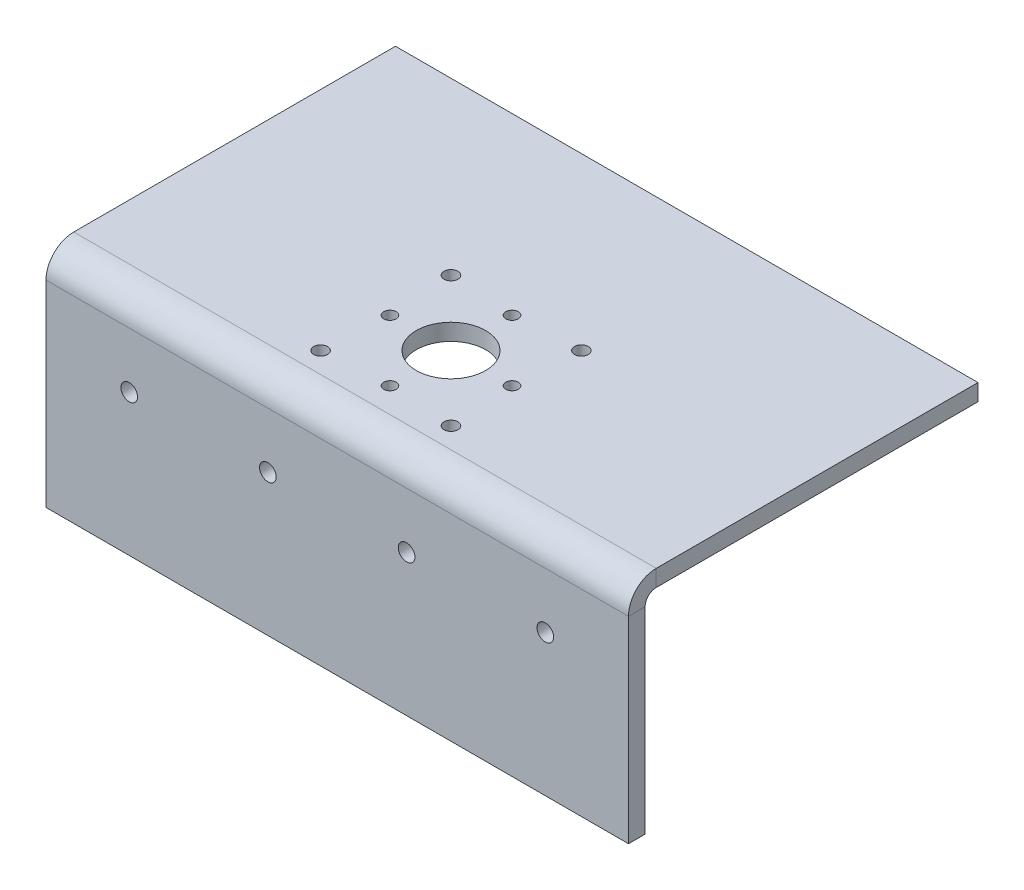
ISO-10303-21;
HEADER;
FILE_DESCRIPTION(('STEP AP214'),'2;1');
FILE_NAME('part.step','',(''),(''),'','','');
FILE_SCHEMA(('AUTOMOTIVE_DESIGN { 1 0 10303 214 1 1 1 1 }'));
ENDSEC;
DATA;
#1=APPLICATION_CONTEXT('core data for automotive mechanical design processes');
#2=APPLICATION_PROTOCOL_DEFINITION('international standard','automotive_design',2000,#1);
#3=PRODUCT_CONTEXT('',#1,'mechanical');
#4=PRODUCT('Part','Part','',(#3));
#5=PRODUCT_RELATED_PRODUCT_CATEGORY('part','',(#4));
#6=PRODUCT_DEFINITION_FORMATION('','',#4);
#7=PRODUCT_DEFINITION_CONTEXT('part definition',#1,'design');
#8=PRODUCT_DEFINITION('design','',#6,#7);
#9=PRODUCT_DEFINITION_SHAPE('','',#8);
#10=(LENGTH_UNIT() NAMED_UNIT(*) SI_UNIT(.MILLI.,.METRE.));
#11=(NAMED_UNIT(*) PLANE_ANGLE_UNIT() SI_UNIT($,.RADIAN.));
#12=(NAMED_UNIT(*) SI_UNIT($,.STERADIAN.) SOLID_ANGLE_UNIT());
#13=UNCERTAINTY_MEASURE_WITH_UNIT(LENGTH_MEASURE(1.E-05),#10,'distance_accuracy_value','');
#14=(GEOMETRIC_REPRESENTATION_CONTEXT(3) GLOBAL_UNCERTAINTY_ASSIGNED_CONTEXT((#13)) GLOBAL_UNIT_ASSIGNED_CONTEXT((#10,
#11,#12)) REPRESENTATION_CONTEXT('',''));
#15=CARTESIAN_POINT('',(0.,0.,0.));
#16=DIRECTION('',(0.,0.,1.));
#17=DIRECTION('',(1.,0.,0.));
#18=AXIS2_PLACEMENT_3D('',#15,#16,#17);
#19=CARTESIAN_POINT('',(105.,-4.,0.));
#20=DIRECTION('',(1.,0.,0.));
#21=DIRECTION('',(0.,0.,-1.));
#22=AXIS2_PLACEMENT_3D('',#19,#20,#21);
#23=PLANE('',#22);
#24=DIRECTION('',(0.,0.,1.));
#25=VECTOR('',#24,1.);
#26=CARTESIAN_POINT('',(105.,-4.,0.));
#27=LINE('',#26,#25);
#28=CARTESIAN_POINT('',(105.,-4.,0.));
#29=VERTEX_POINT('',#28);
#30=CARTESIAN_POINT('',(105.,-4.00000000000001,6.));
#31=VERTEX_POINT('',#30);
#32=EDGE_CURVE('E11',#29,#31,#27,.T.);
#33=ORIENTED_EDGE('',*,*,#32,.F.);
#34=CARTESIAN_POINT('',(105.,-4.,-4.));
#35=DIRECTION('',(1.,0.,0.));
#36=DIRECTION('',(0.,0.,-1.));
#37=AXIS2_PLACEMENT_3D('',#34,#35,#36);
#38=CIRCLE('',#37,4.);
#39=CARTESIAN_POINT('',(105.,0.,-4.));
#40=VERTEX_POINT('',#39);
#41=EDGE_CURVE('E129',#29,#40,#38,.F.);
#42=ORIENTED_EDGE('',*,*,#41,.T.);
#43=DIRECTION('',(0.,-1.,0.));
#44=VECTOR('',#43,1.);
#45=CARTESIAN_POINT('',(105.,6.,-4.));
#46=LINE('',#45,#44);
#47=CARTESIAN_POINT('',(105.,6.,-4.));
#48=VERTEX_POINT('',#47);
#49=EDGE_CURVE('E46',#48,#40,#46,.T.);
#50=ORIENTED_EDGE('',*,*,#49,.F.);
#51=CARTESIAN_POINT('',(105.,-4.,-4.));
#52=DIRECTION('',(1.,0.,0.));
#53=DIRECTION('',(0.,0.,-1.));
#54=AXIS2_PLACEMENT_3D('',#51,#52,#53);
#55=CIRCLE('',#54,10.);
#56=EDGE_CURVE('E136',#31,#48,#55,.F.);
#57=ORIENTED_EDGE('',*,*,#56,.F.);
#58=EDGE_LOOP('',(#33,#42,#50,#57));
#59=FACE_BOUND('',#58,.T.);
#60=ADVANCED_FACE('F37',(#59),#23,.T.);
#61=CARTESIAN_POINT('',(105.,6.,-4.));
#62=DIRECTION('',(1.,0.,0.));
#63=DIRECTION('',(0.,0.,-1.));
#64=AXIS2_PLACEMENT_3D('',#61,#62,#63);
#65=PLANE('',#64);
#66=DIRECTION('',(0.,1.,0.));
#67=VECTOR('',#66,1.);
#68=CARTESIAN_POINT('',(105.,-75.,0.));
#69=LINE('',#68,#67);
#70=CARTESIAN_POINT('',(105.,-75.,0.));
#71=VERTEX_POINT('',#70);
#72=EDGE_CURVE('E124',#71,#29,#69,.T.);
#73=ORIENTED_EDGE('',*,*,#72,.T.);
#74=ORIENTED_EDGE('',*,*,#32,.T.);
#75=DIRECTION('',(0.,1.,0.));
#76=VECTOR('',#75,1.);
#77=CARTESIAN_POINT('',(105.,-75.,6.));
#78=LINE('',#77,#76);
#79=CARTESIAN_POINT('',(105.,-75.,6.));
#80=VERTEX_POINT('',#79);
#81=EDGE_CURVE('E134',#80,#31,#78,.T.);
#82=ORIENTED_EDGE('',*,*,#81,.F.);
#83=DIRECTION('',(0.,0.,1.));
#84=VECTOR('',#83,1.);
#85=CARTESIAN_POINT('',(105.,-75.,0.));
#86=LINE('',#85,#84);
#87=EDGE_CURVE('E115',#71,#80,#86,.T.);
#88=ORIENTED_EDGE('',*,*,#87,.F.);
#89=EDGE_LOOP('',(#73,#74,#82,#88));
#90=FACE_BOUND('',#89,.T.);
#91=ADVANCED_FACE('F132',(#90),#65,.T.);
#92=CARTESIAN_POINT('',(-105.,0.,-4.));
#93=DIRECTION('',(-1.,0.,0.));
#94=DIRECTION('',(0.,0.,1.));
#95=AXIS2_PLACEMENT_3D('',#92,#93,#94);
#96=PLANE('',#95);
#97=DIRECTION('',(0.,1.,0.));
#98=VECTOR('',#97,1.);
#99=CARTESIAN_POINT('',(-105.,0.,-4.));
#100=LINE('',#99,#98);
#101=CARTESIAN_POINT('',(-105.,0.,-4.));
#102=VERTEX_POINT('',#101);
#103=CARTESIAN_POINT('',(-105.,6.,-4.));
#104=VERTEX_POINT('',#103);
#105=EDGE_CURVE('E90',#102,#104,#100,.T.);
#106=ORIENTED_EDGE('',*,*,#105,.F.);
#107=CARTESIAN_POINT('',(-105.,-4.,-4.));
#108=DIRECTION('',(1.,0.,0.));
#109=DIRECTION('',(0.,0.,-1.));
#110=AXIS2_PLACEMENT_3D('',#107,#108,#109);
#111=CIRCLE('',#110,4.);
#112=CARTESIAN_POINT('',(-105.,-4.,0.));
#113=VERTEX_POINT('',#112);
#114=EDGE_CURVE('E159',#113,#102,#111,.F.);
#115=ORIENTED_EDGE('',*,*,#114,.F.);
#116=DIRECTION('',(0.,0.,-1.));
#117=VECTOR('',#116,1.);
#118=CARTESIAN_POINT('',(-105.,-4.00000000000001,6.));
#119=LINE('',#118,#117);
#120=CARTESIAN_POINT('',(-105.,-4.00000000000001,6.));
#121=VERTEX_POINT('',#120);
#122=EDGE_CURVE('E83',#121,#113,#119,.T.);
#123=ORIENTED_EDGE('',*,*,#122,.F.);
#124=CARTESIAN_POINT('',(-105.,-4.,-4.));
#125=DIRECTION('',(1.,0.,0.));
#126=DIRECTION('',(0.,0.,-1.));
#127=AXIS2_PLACEMENT_3D('',#124,#125,#126);
#128=CIRCLE('',#127,10.);
#129=EDGE_CURVE('E152',#121,#104,#128,.F.);
#130=ORIENTED_EDGE('',*,*,#129,.T.);
#131=EDGE_LOOP('',(#106,#115,#123,#130));
#132=FACE_BOUND('',#131,.T.);
#133=ADVANCED_FACE('F242',(#132),#96,.T.);
#134=CARTESIAN_POINT('',(-105.,-4.00000000000001,6.));
#135=DIRECTION('',(-1.,0.,0.));
#136=DIRECTION('',(0.,0.,1.));
#137=AXIS2_PLACEMENT_3D('',#134,#135,#136);
#138=PLANE('',#137);
#139=DIRECTION('',(0.,0.,-1.));
#140=VECTOR('',#139,1.);
#141=CARTESIAN_POINT('',(-105.,0.,0.));
#142=LINE('',#141,#140);
#143=CARTESIAN_POINT('',(-105.,0.,-120.));
#144=VERTEX_POINT('',#143);
#145=EDGE_CURVE('E142',#102,#144,#142,.T.);
#146=ORIENTED_EDGE('',*,*,#145,.F.);
#147=ORIENTED_EDGE('',*,*,#105,.T.);
#148=DIRECTION('',(0.,0.,-1.));
#149=VECTOR('',#148,1.);
#150=CARTESIAN_POINT('',(-105.,6.,0.));
#151=LINE('',#150,#149);
#152=CARTESIAN_POINT('',(-105.,6.,-120.));
#153=VERTEX_POINT('',#152);
#154=EDGE_CURVE('E149',#104,#153,#151,.T.);
#155=ORIENTED_EDGE('',*,*,#154,.T.);
#156=DIRECTION('',(0.,-1.,0.));
#157=VECTOR('',#156,1.);
#158=CARTESIAN_POINT('',(-105.,6.,-120.));
#159=LINE('',#158,#157);
#160=EDGE_CURVE('E145',#153,#144,#159,.T.);
#161=ORIENTED_EDGE('',*,*,#160,.T.);
#162=EDGE_LOOP('',(#146,#147,#155,#161));
#163=FACE_BOUND('',#162,.T.);
#164=ADVANCED_FACE('F244',(#163),#138,.T.);
#165=CARTESIAN_POINT('',(105.,0.,0.));
#166=DIRECTION('',(0.,1.,0.));
#167=DIRECTION('',(0.,0.,1.));
#168=AXIS2_PLACEMENT_3D('',#165,#166,#167);
#169=PLANE('',#168);
#170=CARTESIAN_POINT('',(0.,0.,-13.));
#171=DIRECTION('',(0.,1.,0.));
#172=DIRECTION('',(0.,0.,1.));
#173=AXIS2_PLACEMENT_3D('',#170,#171,#172);
#174=CIRCLE('',#173,2.25);
#175=CARTESIAN_POINT('',(0.,0.,-10.75));
#176=VERTEX_POINT('',#175);
#177=EDGE_CURVE('E509',#176,#176,#174,.T.);
#178=ORIENTED_EDGE('',*,*,#177,.T.);
#179=EDGE_LOOP('',(#178));
#180=FACE_BOUND('',#179,.T.);
#181=CARTESIAN_POINT('',(-22.,0.,-35.));
#182=DIRECTION('',(0.,1.,0.));
#183=DIRECTION('',(0.,0.,1.));
#184=AXIS2_PLACEMENT_3D('',#181,#182,#183);
#185=CIRCLE('',#184,2.24999999999992);
#186=CARTESIAN_POINT('',(-22.,0.,-32.7500000000001));
#187=VERTEX_POINT('',#186);
#188=EDGE_CURVE('E511',#187,#187,#185,.T.);
#189=ORIENTED_EDGE('',*,*,#188,.T.);
#190=EDGE_LOOP('',(#189));
#191=FACE_BOUND('',#190,.T.);
#192=CARTESIAN_POINT('',(1.58768695465517E-13,0.,-57.));
#193=DIRECTION('',(0.,1.,0.));
#194=DIRECTION('',(0.,0.,1.));
#195=AXIS2_PLACEMENT_3D('',#192,#193,#194);
#196=CIRCLE('',#195,2.25);
#197=CARTESIAN_POINT('',(1.58768695465517E-13,0.,-54.75));
#198=VERTEX_POINT('',#197);
#199=EDGE_CURVE('E517',#198,#198,#196,.T.);
#200=ORIENTED_EDGE('',*,*,#199,.T.);
#201=EDGE_LOOP('',(#200));
#202=FACE_BOUND('',#201,.T.);
#203=CARTESIAN_POINT('',(22.,0.,-35.));
#204=DIRECTION('',(0.,1.,0.));
#205=DIRECTION('',(0.,0.,1.));
#206=AXIS2_PLACEMENT_3D('',#203,#204,#205);
#207=CIRCLE('',#206,2.24999999999976);
#208=CARTESIAN_POINT('',(22.,0.,-32.7500000000002));
#209=VERTEX_POINT('',#208);
#210=EDGE_CURVE('E566',#209,#209,#207,.T.);
#211=ORIENTED_EDGE('',*,*,#210,.T.);
#212=EDGE_LOOP('',(#211));
#213=FACE_BOUND('',#212,.T.);
#214=CARTESIAN_POINT('',(23.5,0.,-11.5));
#215=DIRECTION('',(0.,1.,0.));
#216=DIRECTION('',(0.,0.,1.));
#217=AXIS2_PLACEMENT_3D('',#214,#215,#216);
#218=CIRCLE('',#217,2.5);
#219=CARTESIAN_POINT('',(23.5,0.,-9.));
#220=VERTEX_POINT('',#219);
#221=EDGE_CURVE('E146',#220,#220,#218,.T.);
#222=ORIENTED_EDGE('',*,*,#221,.T.);
#223=EDGE_LOOP('',(#222));
#224=FACE_BOUND('',#223,.T.);
#225=CARTESIAN_POINT('',(-23.5,0.,-11.5));
#226=DIRECTION('',(0.,1.,0.));
#227=DIRECTION('',(0.,0.,1.));
#228=AXIS2_PLACEMENT_3D('',#225,#226,#227);
#229=CIRCLE('',#228,2.5);
#230=CARTESIAN_POINT('',(-23.5,0.,-9.));
#231=VERTEX_POINT('',#230);
#232=EDGE_CURVE('E215',#231,#231,#229,.T.);
#233=ORIENTED_EDGE('',*,*,#232,.T.);
#234=EDGE_LOOP('',(#233));
#235=FACE_BOUND('',#234,.T.);
#236=CARTESIAN_POINT('',(-23.5,0.,-58.5));
#237=DIRECTION('',(0.,1.,0.));
#238=DIRECTION('',(0.,0.,1.));
#239=AXIS2_PLACEMENT_3D('',#236,#237,#238);
#240=CIRCLE('',#239,2.5);
#241=CARTESIAN_POINT('',(-23.5,0.,-56.));
#242=VERTEX_POINT('',#241);
#243=EDGE_CURVE('E212',#242,#242,#240,.T.);
#244=ORIENTED_EDGE('',*,*,#243,.T.);
#245=EDGE_LOOP('',(#244));
#246=FACE_BOUND('',#245,.T.);
#247=CARTESIAN_POINT('',(23.5,0.,-58.5));
#248=DIRECTION('',(0.,1.,0.));
#249=DIRECTION('',(0.,0.,1.));
#250=AXIS2_PLACEMENT_3D('',#247,#248,#249);
#251=CIRCLE('',#250,2.5);
#252=CARTESIAN_POINT('',(23.5,0.,-56.));
#253=VERTEX_POINT('',#252);
#254=EDGE_CURVE('E209',#253,#253,#251,.T.);
#255=ORIENTED_EDGE('',*,*,#254,.T.);
#256=EDGE_LOOP('',(#255));
#257=FACE_BOUND('',#256,.T.);
#258=CARTESIAN_POINT('',(0.,0.,-35.));
#259=DIRECTION('',(0.,1.,0.));
#260=DIRECTION('',(0.,0.,1.));
#261=AXIS2_PLACEMENT_3D('',#258,#259,#260);
#262=CIRCLE('',#261,12.5);
#263=CARTESIAN_POINT('',(0.,0.,-22.5));
#264=VERTEX_POINT('',#263);
#265=EDGE_CURVE('E205',#264,#264,#262,.T.);
#266=ORIENTED_EDGE('',*,*,#265,.T.);
#267=EDGE_LOOP('',(#266));
#268=FACE_BOUND('',#267,.T.);
#269=ORIENTED_EDGE('',*,*,#145,.T.);
#270=DIRECTION('',(-1.,0.,0.));
#271=VECTOR('',#270,1.);
#272=CARTESIAN_POINT('',(105.,0.,-120.));
#273=LINE('',#272,#271);
#274=CARTESIAN_POINT('',(105.,0.,-120.));
#275=VERTEX_POINT('',#274);
#276=EDGE_CURVE('E173',#275,#144,#273,.T.);
#277=ORIENTED_EDGE('',*,*,#276,.F.);
#278=DIRECTION('',(0.,0.,-1.));
#279=VECTOR('',#278,1.);
#280=CARTESIAN_POINT('',(105.,0.,0.));
#281=LINE('',#280,#279);
#282=EDGE_CURVE('E96',#40,#275,#281,.T.);
#283=ORIENTED_EDGE('',*,*,#282,.F.);
#284=DIRECTION('',(-1.,0.,0.));
#285=VECTOR('',#284,1.);
#286=CARTESIAN_POINT('',(105.,0.,-4.));
#287=LINE('',#286,#285);
#288=EDGE_CURVE('E141',#40,#102,#287,.T.);
#289=ORIENTED_EDGE('',*,*,#288,.T.);
#290=EDGE_LOOP('',(#269,#277,#283,#289));
#291=FACE_BOUND('',#290,.T.);
#292=ADVANCED_FACE('F250',(#180,#191,#202,#213,#224,#235,#246,#257,#268,#291),#169,.F.);
#293=CARTESIAN_POINT('',(105.,6.,-120.));
#294=DIRECTION('',(0.,0.,-1.));
#295=DIRECTION('',(-1.,0.,0.));
#296=AXIS2_PLACEMENT_3D('',#293,#294,#295);
#297=PLANE('',#296);
#298=ORIENTED_EDGE('',*,*,#160,.F.);
#299=DIRECTION('',(-1.,0.,0.));
#300=VECTOR('',#299,1.);
#301=CARTESIAN_POINT('',(105.,6.,-120.));
#302=LINE('',#301,#300);
#303=CARTESIAN_POINT('',(105.,6.,-120.));
#304=VERTEX_POINT('',#303);
#305=EDGE_CURVE('E171',#304,#153,#302,.T.);
#306=ORIENTED_EDGE('',*,*,#305,.F.);
#307=DIRECTION('',(0.,-1.,0.));
#308=VECTOR('',#307,1.);
#309=CARTESIAN_POINT('',(105.,6.,-120.));
#310=LINE('',#309,#308);
#311=EDGE_CURVE('E221',#304,#275,#310,.T.);
#312=ORIENTED_EDGE('',*,*,#311,.T.);
#313=ORIENTED_EDGE('',*,*,#276,.T.);
#314=EDGE_LOOP('',(#298,#306,#312,#313));
#315=FACE_BOUND('',#314,.T.);
#316=ADVANCED_FACE('F280',(#315),#297,.T.);
#317=CARTESIAN_POINT('',(105.,6.,0.));
#318=DIRECTION('',(0.,1.,0.));
#319=DIRECTION('',(0.,0.,1.));
#320=AXIS2_PLACEMENT_3D('',#317,#318,#319);
#321=PLANE('',#320);
#322=CARTESIAN_POINT('',(0.,6.,-13.));
#323=DIRECTION('',(0.,1.,0.));
#324=DIRECTION('',(0.,0.,1.));
#325=AXIS2_PLACEMENT_3D('',#322,#323,#324);
#326=CIRCLE('',#325,2.25);
#327=CARTESIAN_POINT('',(0.,6.,-10.75));
#328=VERTEX_POINT('',#327);
#329=EDGE_CURVE('E506',#328,#328,#326,.T.);
#330=ORIENTED_EDGE('',*,*,#329,.F.);
#331=EDGE_LOOP('',(#330));
#332=FACE_BOUND('',#331,.T.);
#333=CARTESIAN_POINT('',(-22.,6.,-35.));
#334=DIRECTION('',(0.,1.,0.));
#335=DIRECTION('',(0.,0.,1.));
#336=AXIS2_PLACEMENT_3D('',#333,#334,#335);
#337=CIRCLE('',#336,2.24999999999992);
#338=CARTESIAN_POINT('',(-22.,6.,-32.7500000000001));
#339=VERTEX_POINT('',#338);
#340=EDGE_CURVE('E575',#339,#339,#337,.T.);
#341=ORIENTED_EDGE('',*,*,#340,.F.);
#342=EDGE_LOOP('',(#341));
#343=FACE_BOUND('',#342,.T.);
#344=CARTESIAN_POINT('',(1.58768695465517E-13,6.,-57.));
#345=DIRECTION('',(0.,1.,0.));
#346=DIRECTION('',(0.,0.,1.));
#347=AXIS2_PLACEMENT_3D('',#344,#345,#346);
#348=CIRCLE('',#347,2.25);
#349=CARTESIAN_POINT('',(1.58768695465517E-13,6.,-54.75));
#350=VERTEX_POINT('',#349);
#351=EDGE_CURVE('E572',#350,#350,#348,.T.);
#352=ORIENTED_EDGE('',*,*,#351,.F.);
#353=EDGE_LOOP('',(#352));
#354=FACE_BOUND('',#353,.T.);
#355=CARTESIAN_POINT('',(22.,6.,-35.));
#356=DIRECTION('',(0.,1.,0.));
#357=DIRECTION('',(0.,0.,1.));
#358=AXIS2_PLACEMENT_3D('',#355,#356,#357);
#359=CIRCLE('',#358,2.24999999999976);
#360=CARTESIAN_POINT('',(22.,6.,-32.7500000000002));
#361=VERTEX_POINT('',#360);
#362=EDGE_CURVE('E569',#361,#361,#359,.T.);
#363=ORIENTED_EDGE('',*,*,#362,.F.);
#364=EDGE_LOOP('',(#363));
#365=FACE_BOUND('',#364,.T.);
#366=CARTESIAN_POINT('',(23.5,6.,-11.5));
#367=DIRECTION('',(0.,1.,0.));
#368=DIRECTION('',(0.,0.,1.));
#369=AXIS2_PLACEMENT_3D('',#366,#367,#368);
#370=CIRCLE('',#369,2.5);
#371=CARTESIAN_POINT('',(23.5,6.,-9.));
#372=VERTEX_POINT('',#371);
#373=EDGE_CURVE('E189',#372,#372,#370,.T.);
#374=ORIENTED_EDGE('',*,*,#373,.F.);
#375=EDGE_LOOP('',(#374));
#376=FACE_BOUND('',#375,.T.);
#377=CARTESIAN_POINT('',(-23.5,6.,-11.5));
#378=DIRECTION('',(0.,1.,0.));
#379=DIRECTION('',(0.,0.,1.));
#380=AXIS2_PLACEMENT_3D('',#377,#378,#379);
#381=CIRCLE('',#380,2.5);
#382=CARTESIAN_POINT('',(-23.5,6.,-9.));
#383=VERTEX_POINT('',#382);
#384=EDGE_CURVE('E193',#383,#383,#381,.T.);
#385=ORIENTED_EDGE('',*,*,#384,.F.);
#386=EDGE_LOOP('',(#385));
#387=FACE_BOUND('',#386,.T.);
#388=CARTESIAN_POINT('',(-23.5,6.,-58.5));
#389=DIRECTION('',(0.,1.,0.));
#390=DIRECTION('',(0.,0.,1.));
#391=AXIS2_PLACEMENT_3D('',#388,#389,#390);
#392=CIRCLE('',#391,2.5);
#393=CARTESIAN_POINT('',(-23.5,6.,-56.));
#394=VERTEX_POINT('',#393);
#395=EDGE_CURVE('E198',#394,#394,#392,.T.);
#396=ORIENTED_EDGE('',*,*,#395,.F.);
#397=EDGE_LOOP('',(#396));
#398=FACE_BOUND('',#397,.T.);
#399=CARTESIAN_POINT('',(23.5,6.,-58.5));
#400=DIRECTION('',(0.,1.,0.));
#401=DIRECTION('',(0.,0.,1.));
#402=AXIS2_PLACEMENT_3D('',#399,#400,#401);
#403=CIRCLE('',#402,2.5);
#404=CARTESIAN_POINT('',(23.5,6.,-56.));
#405=VERTEX_POINT('',#404);
#406=EDGE_CURVE('E206',#405,#405,#403,.T.);
#407=ORIENTED_EDGE('',*,*,#406,.F.);
#408=EDGE_LOOP('',(#407));
#409=FACE_BOUND('',#408,.T.);
#410=CARTESIAN_POINT('',(0.,6.,-35.));
#411=DIRECTION('',(0.,1.,0.));
#412=DIRECTION('',(0.,0.,1.));
#413=AXIS2_PLACEMENT_3D('',#410,#411,#412);
#414=CIRCLE('',#413,12.5);
#415=CARTESIAN_POINT('',(0.,6.,-22.5));
#416=VERTEX_POINT('',#415);
#417=EDGE_CURVE('E202',#416,#416,#414,.T.);
#418=ORIENTED_EDGE('',*,*,#417,.F.);
#419=EDGE_LOOP('',(#418));
#420=FACE_BOUND('',#419,.T.);
#421=ORIENTED_EDGE('',*,*,#154,.F.);
#422=DIRECTION('',(-1.,0.,0.));
#423=VECTOR('',#422,1.);
#424=CARTESIAN_POINT('',(105.,6.,-4.));
#425=LINE('',#424,#423);
#426=EDGE_CURVE('E168',#48,#104,#425,.T.);
#427=ORIENTED_EDGE('',*,*,#426,.F.);
#428=DIRECTION('',(0.,0.,-1.));
#429=VECTOR('',#428,1.);
#430=CARTESIAN_POINT('',(105.,6.,0.));
#431=LINE('',#430,#429);
#432=EDGE_CURVE('E224',#48,#304,#431,.T.);
#433=ORIENTED_EDGE('',*,*,#432,.T.);
#434=ORIENTED_EDGE('',*,*,#305,.T.);
#435=EDGE_LOOP('',(#421,#427,#433,#434));
#436=FACE_BOUND('',#435,.T.);
#437=ADVANCED_FACE('F285',(#332,#343,#354,#365,#376,#387,#398,#409,#420,#436),#321,.T.);
#438=CARTESIAN_POINT('',(105.,-4.,-4.));
#439=DIRECTION('',(-1.,0.,0.));
#440=DIRECTION('',(0.,0.,1.));
#441=AXIS2_PLACEMENT_3D('',#438,#439,#440);
#442=CYLINDRICAL_SURFACE('',#441,10.);
#443=ORIENTED_EDGE('',*,*,#129,.F.);
#444=DIRECTION('',(-1.,0.,0.));
#445=VECTOR('',#444,1.);
#446=CARTESIAN_POINT('',(105.,-4.00000000000001,6.));
#447=LINE('',#446,#445);
#448=EDGE_CURVE('E165',#31,#121,#447,.T.);
#449=ORIENTED_EDGE('',*,*,#448,.F.);
#450=ORIENTED_EDGE('',*,*,#56,.T.);
#451=ORIENTED_EDGE('',*,*,#426,.T.);
#452=EDGE_LOOP('',(#443,#449,#450,#451));
#453=FACE_BOUND('',#452,.T.);
#454=ADVANCED_FACE('F231',(#453),#442,.T.);
#455=CARTESIAN_POINT('',(105.,-75.,6.));
#456=DIRECTION('',(0.,0.,1.));
#457=DIRECTION('',(1.,0.,0.));
#458=AXIS2_PLACEMENT_3D('',#455,#456,#457);
#459=PLANE('',#458);
#460=CARTESIAN_POINT('',(-75.,-24.,6.));
#461=DIRECTION('',(0.,0.,1.));
#462=DIRECTION('',(1.,0.,0.));
#463=AXIS2_PLACEMENT_3D('',#460,#461,#462);
#464=CIRCLE('',#463,3.00000000000001);
#465=CARTESIAN_POINT('',(-72.,-24.,6.));
#466=VERTEX_POINT('',#465);
#467=EDGE_CURVE('E182',#466,#466,#464,.T.);
#468=ORIENTED_EDGE('',*,*,#467,.F.);
#469=EDGE_LOOP('',(#468));
#470=FACE_BOUND('',#469,.T.);
#471=CARTESIAN_POINT('',(-25.,-24.,6.));
#472=DIRECTION('',(0.,0.,1.));
#473=DIRECTION('',(1.,0.,0.));
#474=AXIS2_PLACEMENT_3D('',#471,#472,#473);
#475=CIRCLE('',#474,3.);
#476=CARTESIAN_POINT('',(-22.,-24.,6.));
#477=VERTEX_POINT('',#476);
#478=EDGE_CURVE('E523',#477,#477,#475,.T.);
#479=ORIENTED_EDGE('',*,*,#478,.F.);
#480=EDGE_LOOP('',(#479));
#481=FACE_BOUND('',#480,.T.);
#482=CARTESIAN_POINT('',(25.,-24.,6.));
#483=DIRECTION('',(0.,0.,1.));
#484=DIRECTION('',(1.,0.,0.));
#485=AXIS2_PLACEMENT_3D('',#482,#483,#484);
#486=CIRCLE('',#485,3.);
#487=CARTESIAN_POINT('',(28.,-24.,6.));
#488=VERTEX_POINT('',#487);
#489=EDGE_CURVE('E514',#488,#488,#486,.T.);
#490=ORIENTED_EDGE('',*,*,#489,.F.);
#491=EDGE_LOOP('',(#490));
#492=FACE_BOUND('',#491,.T.);
#493=CARTESIAN_POINT('',(75.,-24.,6.));
#494=DIRECTION('',(0.,0.,1.));
#495=DIRECTION('',(1.,0.,0.));
#496=AXIS2_PLACEMENT_3D('',#493,#494,#495);
#497=CIRCLE('',#496,3.00000000000001);
#498=CARTESIAN_POINT('',(78.,-24.,6.));
#499=VERTEX_POINT('',#498);
#500=EDGE_CURVE('E510',#499,#499,#497,.T.);
#501=ORIENTED_EDGE('',*,*,#500,.F.);
#502=EDGE_LOOP('',(#501));
#503=FACE_BOUND('',#502,.T.);
#504=DIRECTION('',(0.,1.,0.));
#505=VECTOR('',#504,1.);
#506=CARTESIAN_POINT('',(-105.,-75.,6.));
#507=LINE('',#506,#505);
#508=CARTESIAN_POINT('',(-105.,-75.,6.));
#509=VERTEX_POINT('',#508);
#510=EDGE_CURVE('E154',#509,#121,#507,.T.);
#511=ORIENTED_EDGE('',*,*,#510,.F.);
#512=DIRECTION('',(-1.,0.,0.));
#513=VECTOR('',#512,1.);
#514=CARTESIAN_POINT('',(105.,-75.,6.));
#515=LINE('',#514,#513);
#516=EDGE_CURVE('E119',#80,#509,#515,.T.);
#517=ORIENTED_EDGE('',*,*,#516,.F.);
#518=ORIENTED_EDGE('',*,*,#81,.T.);
#519=ORIENTED_EDGE('',*,*,#448,.T.);
#520=EDGE_LOOP('',(#511,#517,#518,#519));
#521=FACE_BOUND('',#520,.T.);
#522=ADVANCED_FACE('F237',(#470,#481,#492,#503,#521),#459,.T.);
#523=CARTESIAN_POINT('',(105.,-75.,0.));
#524=DIRECTION('',(0.,-1.,0.));
#525=DIRECTION('',(0.,0.,-1.));
#526=AXIS2_PLACEMENT_3D('',#523,#524,#525);
#527=PLANE('',#526);
#528=DIRECTION('',(0.,0.,1.));
#529=VECTOR('',#528,1.);
#530=CARTESIAN_POINT('',(-105.,-75.,0.));
#531=LINE('',#530,#529);
#532=CARTESIAN_POINT('',(-105.,-75.,0.));
#533=VERTEX_POINT('',#532);
#534=EDGE_CURVE('E117',#533,#509,#531,.T.);
#535=ORIENTED_EDGE('',*,*,#534,.F.);
#536=DIRECTION('',(-1.,0.,0.));
#537=VECTOR('',#536,1.);
#538=CARTESIAN_POINT('',(105.,-75.,0.));
#539=LINE('',#538,#537);
#540=EDGE_CURVE('E111',#71,#533,#539,.T.);
#541=ORIENTED_EDGE('',*,*,#540,.F.);
#542=ORIENTED_EDGE('',*,*,#87,.T.);
#543=ORIENTED_EDGE('',*,*,#516,.T.);
#544=EDGE_LOOP('',(#535,#541,#542,#543));
#545=FACE_BOUND('',#544,.T.);
#546=ADVANCED_FACE('F113',(#545),#527,.T.);
#547=CARTESIAN_POINT('',(105.,-75.,0.));
#548=DIRECTION('',(0.,0.,1.));
#549=DIRECTION('',(1.,0.,0.));
#550=AXIS2_PLACEMENT_3D('',#547,#548,#549);
#551=PLANE('',#550);
#552=CARTESIAN_POINT('',(-75.,-24.,0.));
#553=DIRECTION('',(0.,0.,1.));
#554=DIRECTION('',(1.,0.,0.));
#555=AXIS2_PLACEMENT_3D('',#552,#553,#554);
#556=CIRCLE('',#555,3.00000000000001);
#557=CARTESIAN_POINT('',(-72.,-24.,0.));
#558=VERTEX_POINT('',#557);
#559=EDGE_CURVE('E40',#558,#558,#556,.T.);
#560=ORIENTED_EDGE('',*,*,#559,.T.);
#561=EDGE_LOOP('',(#560));
#562=FACE_BOUND('',#561,.T.);
#563=CARTESIAN_POINT('',(-25.,-24.,0.));
#564=DIRECTION('',(0.,0.,1.));
#565=DIRECTION('',(1.,0.,0.));
#566=AXIS2_PLACEMENT_3D('',#563,#564,#565);
#567=CIRCLE('',#566,3.);
#568=CARTESIAN_POINT('',(-22.,-24.,0.));
#569=VERTEX_POINT('',#568);
#570=EDGE_CURVE('E184',#569,#569,#567,.T.);
#571=ORIENTED_EDGE('',*,*,#570,.T.);
#572=EDGE_LOOP('',(#571));
#573=FACE_BOUND('',#572,.T.);
#574=CARTESIAN_POINT('',(25.,-24.,0.));
#575=DIRECTION('',(0.,0.,1.));
#576=DIRECTION('',(1.,0.,0.));
#577=AXIS2_PLACEMENT_3D('',#574,#575,#576);
#578=CIRCLE('',#577,3.);
#579=CARTESIAN_POINT('',(28.,-24.,0.));
#580=VERTEX_POINT('',#579);
#581=EDGE_CURVE('E181',#580,#580,#578,.T.);
#582=ORIENTED_EDGE('',*,*,#581,.T.);
#583=EDGE_LOOP('',(#582));
#584=FACE_BOUND('',#583,.T.);
#585=CARTESIAN_POINT('',(75.,-24.,0.));
#586=DIRECTION('',(0.,0.,1.));
#587=DIRECTION('',(1.,0.,0.));
#588=AXIS2_PLACEMENT_3D('',#585,#586,#587);
#589=CIRCLE('',#588,3.00000000000001);
#590=CARTESIAN_POINT('',(78.,-24.,0.));
#591=VERTEX_POINT('',#590);
#592=EDGE_CURVE('E178',#591,#591,#589,.T.);
#593=ORIENTED_EDGE('',*,*,#592,.T.);
#594=EDGE_LOOP('',(#593));
#595=FACE_BOUND('',#594,.T.);
#596=DIRECTION('',(0.,1.,0.));
#597=VECTOR('',#596,1.);
#598=CARTESIAN_POINT('',(-105.,-75.,0.));
#599=LINE('',#598,#597);
#600=EDGE_CURVE('E157',#533,#113,#599,.T.);
#601=ORIENTED_EDGE('',*,*,#600,.T.);
#602=DIRECTION('',(-1.,0.,0.));
#603=VECTOR('',#602,1.);
#604=CARTESIAN_POINT('',(105.,-4.,0.));
#605=LINE('',#604,#603);
#606=EDGE_CURVE('E120',#29,#113,#605,.T.);
#607=ORIENTED_EDGE('',*,*,#606,.F.);
#608=ORIENTED_EDGE('',*,*,#72,.F.);
#609=ORIENTED_EDGE('',*,*,#540,.T.);
#610=EDGE_LOOP('',(#601,#607,#608,#609));
#611=FACE_BOUND('',#610,.T.);
#612=ADVANCED_FACE('F125',(#562,#573,#584,#595,#611),#551,.F.);
#613=CARTESIAN_POINT('',(105.,-4.,-4.));
#614=DIRECTION('',(-1.,0.,0.));
#615=DIRECTION('',(0.,0.,1.));
#616=AXIS2_PLACEMENT_3D('',#613,#614,#615);
#617=CYLINDRICAL_SURFACE('',#616,4.);
#618=ORIENTED_EDGE('',*,*,#114,.T.);
#619=ORIENTED_EDGE('',*,*,#288,.F.);
#620=ORIENTED_EDGE('',*,*,#41,.F.);
#621=ORIENTED_EDGE('',*,*,#606,.T.);
#622=EDGE_LOOP('',(#618,#619,#620,#621));
#623=FACE_BOUND('',#622,.T.);
#624=ADVANCED_FACE('F240',(#623),#617,.F.);
#625=CARTESIAN_POINT('',(105.,-4.,-4.));
#626=DIRECTION('',(1.,0.,0.));
#627=DIRECTION('',(0.,0.,-1.));
#628=AXIS2_PLACEMENT_3D('',#625,#626,#627);
#629=PLANE('',#628);
#630=ORIENTED_EDGE('',*,*,#282,.T.);
#631=ORIENTED_EDGE('',*,*,#311,.F.);
#632=ORIENTED_EDGE('',*,*,#432,.F.);
#633=ORIENTED_EDGE('',*,*,#49,.T.);
#634=EDGE_LOOP('',(#630,#631,#632,#633));
#635=FACE_BOUND('',#634,.T.);
#636=ADVANCED_FACE('F320',(#635),#629,.T.);
#637=CARTESIAN_POINT('',(-105.,-4.,-4.));
#638=DIRECTION('',(1.,0.,0.));
#639=DIRECTION('',(0.,0.,-1.));
#640=AXIS2_PLACEMENT_3D('',#637,#638,#639);
#641=PLANE('',#640);
#642=ORIENTED_EDGE('',*,*,#510,.T.);
#643=ORIENTED_EDGE('',*,*,#122,.T.);
#644=ORIENTED_EDGE('',*,*,#600,.F.);
#645=ORIENTED_EDGE('',*,*,#534,.T.);
#646=EDGE_LOOP('',(#642,#643,#644,#645));
#647=FACE_BOUND('',#646,.T.);
#648=ADVANCED_FACE('F238',(#647),#641,.F.);
#649=CARTESIAN_POINT('',(0.,-4.,-35.));
#650=DIRECTION('',(0.,1.,0.));
#651=DIRECTION('',(0.,0.,1.));
#652=AXIS2_PLACEMENT_3D('',#649,#650,#651);
#653=CYLINDRICAL_SURFACE('',#652,12.5);
#654=ORIENTED_EDGE('',*,*,#417,.T.);
#655=EDGE_LOOP('',(#654));
#656=FACE_BOUND('',#655,.T.);
#657=ORIENTED_EDGE('',*,*,#265,.F.);
#658=EDGE_LOOP('',(#657));
#659=FACE_BOUND('',#658,.T.);
#660=ADVANCED_FACE('F339',(#656,#659),#653,.F.);
#661=CARTESIAN_POINT('',(23.5,-4.,-58.5));
#662=DIRECTION('',(0.,1.,0.));
#663=DIRECTION('',(0.,0.,1.));
#664=AXIS2_PLACEMENT_3D('',#661,#662,#663);
#665=CYLINDRICAL_SURFACE('',#664,2.5);
#666=ORIENTED_EDGE('',*,*,#406,.T.);
#667=EDGE_LOOP('',(#666));
#668=FACE_BOUND('',#667,.T.);
#669=ORIENTED_EDGE('',*,*,#254,.F.);
#670=EDGE_LOOP('',(#669));
#671=FACE_BOUND('',#670,.T.);
#672=ADVANCED_FACE('F349',(#668,#671),#665,.F.);
#673=CARTESIAN_POINT('',(-23.5,-4.,-58.5));
#674=DIRECTION('',(0.,1.,0.));
#675=DIRECTION('',(0.,0.,1.));
#676=AXIS2_PLACEMENT_3D('',#673,#674,#675);
#677=CYLINDRICAL_SURFACE('',#676,2.5);
#678=ORIENTED_EDGE('',*,*,#395,.T.);
#679=EDGE_LOOP('',(#678));
#680=FACE_BOUND('',#679,.T.);
#681=ORIENTED_EDGE('',*,*,#243,.F.);
#682=EDGE_LOOP('',(#681));
#683=FACE_BOUND('',#682,.T.);
#684=ADVANCED_FACE('F359',(#680,#683),#677,.F.);
#685=CARTESIAN_POINT('',(-23.5,-4.,-11.5));
#686=DIRECTION('',(0.,1.,0.));
#687=DIRECTION('',(0.,0.,1.));
#688=AXIS2_PLACEMENT_3D('',#685,#686,#687);
#689=CYLINDRICAL_SURFACE('',#688,2.5);
#690=ORIENTED_EDGE('',*,*,#384,.T.);
#691=EDGE_LOOP('',(#690));
#692=FACE_BOUND('',#691,.T.);
#693=ORIENTED_EDGE('',*,*,#232,.F.);
#694=EDGE_LOOP('',(#693));
#695=FACE_BOUND('',#694,.T.);
#696=ADVANCED_FACE('F369',(#692,#695),#689,.F.);
#697=CARTESIAN_POINT('',(23.5,-4.,-11.5));
#698=DIRECTION('',(0.,1.,0.));
#699=DIRECTION('',(0.,0.,1.));
#700=AXIS2_PLACEMENT_3D('',#697,#698,#699);
#701=CYLINDRICAL_SURFACE('',#700,2.5);
#702=ORIENTED_EDGE('',*,*,#373,.T.);
#703=EDGE_LOOP('',(#702));
#704=FACE_BOUND('',#703,.T.);
#705=ORIENTED_EDGE('',*,*,#221,.F.);
#706=EDGE_LOOP('',(#705));
#707=FACE_BOUND('',#706,.T.);
#708=ADVANCED_FACE('F379',(#704,#707),#701,.F.);
#709=CARTESIAN_POINT('',(75.,-24.,-4.));
#710=DIRECTION('',(0.,0.,1.));
#711=DIRECTION('',(1.,0.,0.));
#712=AXIS2_PLACEMENT_3D('',#709,#710,#711);
#713=CYLINDRICAL_SURFACE('',#712,3.00000000000001);
#714=ORIENTED_EDGE('',*,*,#500,.T.);
#715=EDGE_LOOP('',(#714));
#716=FACE_BOUND('',#715,.T.);
#717=ORIENTED_EDGE('',*,*,#592,.F.);
#718=EDGE_LOOP('',(#717));
#719=FACE_BOUND('',#718,.T.);
#720=ADVANCED_FACE('F389',(#716,#719),#713,.F.);
#721=CARTESIAN_POINT('',(25.,-24.,-4.));
#722=DIRECTION('',(0.,0.,1.));
#723=DIRECTION('',(1.,0.,0.));
#724=AXIS2_PLACEMENT_3D('',#721,#722,#723);
#725=CYLINDRICAL_SURFACE('',#724,3.);
#726=ORIENTED_EDGE('',*,*,#489,.T.);
#727=EDGE_LOOP('',(#726));
#728=FACE_BOUND('',#727,.T.);
#729=ORIENTED_EDGE('',*,*,#581,.F.);
#730=EDGE_LOOP('',(#729));
#731=FACE_BOUND('',#730,.T.);
#732=ADVANCED_FACE('F413',(#728,#731),#725,.F.);
#733=CARTESIAN_POINT('',(-25.,-24.,-4.));
#734=DIRECTION('',(0.,0.,1.));
#735=DIRECTION('',(1.,0.,0.));
#736=AXIS2_PLACEMENT_3D('',#733,#734,#735);
#737=CYLINDRICAL_SURFACE('',#736,3.);
#738=ORIENTED_EDGE('',*,*,#478,.T.);
#739=EDGE_LOOP('',(#738));
#740=FACE_BOUND('',#739,.T.);
#741=ORIENTED_EDGE('',*,*,#570,.F.);
#742=EDGE_LOOP('',(#741));
#743=FACE_BOUND('',#742,.T.);
#744=ADVANCED_FACE('F423',(#740,#743),#737,.F.);
#745=CARTESIAN_POINT('',(-75.,-24.,-4.));
#746=DIRECTION('',(0.,0.,1.));
#747=DIRECTION('',(1.,0.,0.));
#748=AXIS2_PLACEMENT_3D('',#745,#746,#747);
#749=CYLINDRICAL_SURFACE('',#748,3.00000000000001);
#750=ORIENTED_EDGE('',*,*,#467,.T.);
#751=EDGE_LOOP('',(#750));
#752=FACE_BOUND('',#751,.T.);
#753=ORIENTED_EDGE('',*,*,#559,.F.);
#754=EDGE_LOOP('',(#753));
#755=FACE_BOUND('',#754,.T.);
#756=ADVANCED_FACE('F433',(#752,#755),#749,.F.);
#757=CARTESIAN_POINT('',(22.,-4.,-35.));
#758=DIRECTION('',(0.,1.,0.));
#759=DIRECTION('',(0.,0.,1.));
#760=AXIS2_PLACEMENT_3D('',#757,#758,#759);
#761=CYLINDRICAL_SURFACE('',#760,2.24999999999976);
#762=ORIENTED_EDGE('',*,*,#362,.T.);
#763=EDGE_LOOP('',(#762));
#764=FACE_BOUND('',#763,.T.);
#765=ORIENTED_EDGE('',*,*,#210,.F.);
#766=EDGE_LOOP('',(#765));
#767=FACE_BOUND('',#766,.T.);
#768=ADVANCED_FACE('F443',(#764,#767),#761,.F.);
#769=CARTESIAN_POINT('',(1.58768695465517E-13,-4.,-57.));
#770=DIRECTION('',(0.,1.,0.));
#771=DIRECTION('',(0.,0.,1.));
#772=AXIS2_PLACEMENT_3D('',#769,#770,#771);
#773=CYLINDRICAL_SURFACE('',#772,2.25);
#774=ORIENTED_EDGE('',*,*,#351,.T.);
#775=EDGE_LOOP('',(#774));
#776=FACE_BOUND('',#775,.T.);
#777=ORIENTED_EDGE('',*,*,#199,.F.);
#778=EDGE_LOOP('',(#777));
#779=FACE_BOUND('',#778,.T.);
#780=ADVANCED_FACE('F469',(#776,#779),#773,.F.);
#781=CARTESIAN_POINT('',(-22.,-4.,-35.));
#782=DIRECTION('',(0.,1.,0.));
#783=DIRECTION('',(0.,0.,1.));
#784=AXIS2_PLACEMENT_3D('',#781,#782,#783);
#785=CYLINDRICAL_SURFACE('',#784,2.24999999999992);
#786=ORIENTED_EDGE('',*,*,#340,.T.);
#787=EDGE_LOOP('',(#786));
#788=FACE_BOUND('',#787,.T.);
#789=ORIENTED_EDGE('',*,*,#188,.F.);
#790=EDGE_LOOP('',(#789));
#791=FACE_BOUND('',#790,.T.);
#792=ADVANCED_FACE('F479',(#788,#791),#785,.F.);
#793=CARTESIAN_POINT('',(0.,-4.,-13.));
#794=DIRECTION('',(0.,1.,0.));
#795=DIRECTION('',(0.,0.,1.));
#796=AXIS2_PLACEMENT_3D('',#793,#794,#795);
#797=CYLINDRICAL_SURFACE('',#796,2.25);
#798=ORIENTED_EDGE('',*,*,#329,.T.);
#799=EDGE_LOOP('',(#798));
#800=FACE_BOUND('',#799,.T.);
#801=ORIENTED_EDGE('',*,*,#177,.F.);
#802=EDGE_LOOP('',(#801));
#803=FACE_BOUND('',#802,.T.);
#804=ADVANCED_FACE('F489',(#800,#803),#797,.F.);
#805=CLOSED_SHELL('',(#60,#91,#133,#164,#292,#316,#437,#454,#522,#546,#612,#624,#636,#648,#660,
#672,#684,#696,#708,#720,#732,#744,#756,#768,#780,#792,#804));
#806=MANIFOLD_SOLID_BREP('B2',#805);
#807=ADVANCED_BREP_SHAPE_REPRESENTATION('',(#18,#806),#14);
#808=SHAPE_DEFINITION_REPRESENTATION(#9,#807);
ENDSEC;
END-ISO-10303-21;
